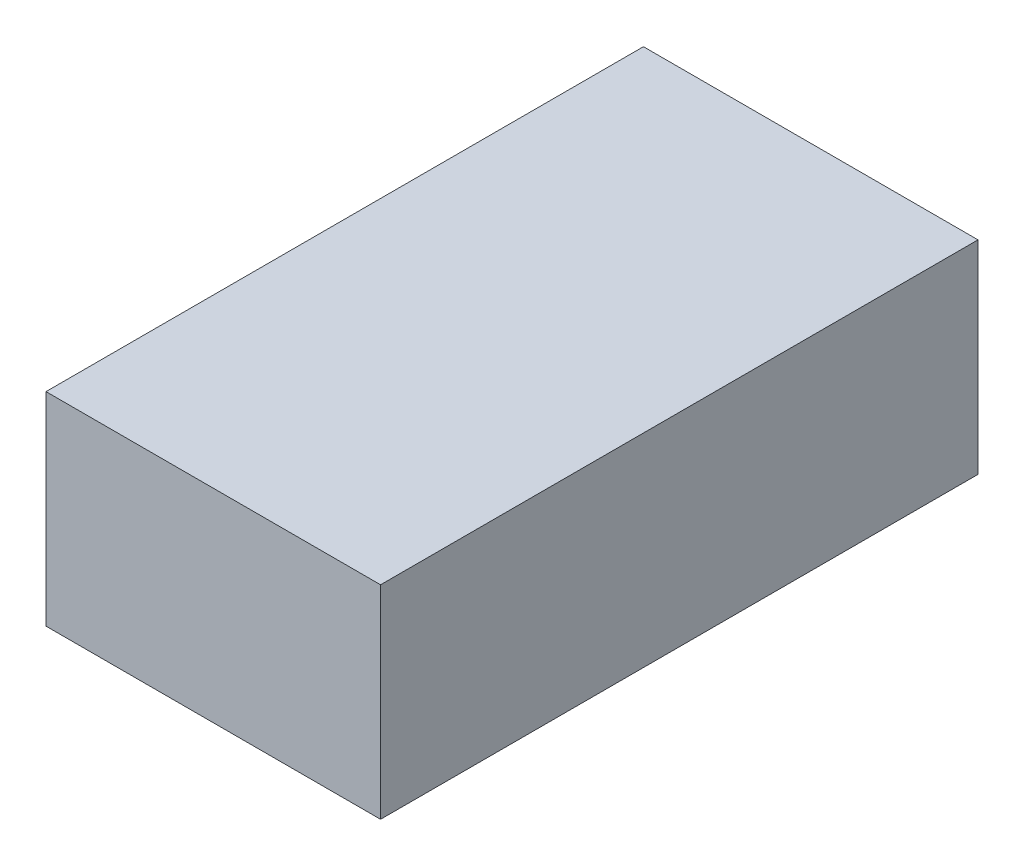
ISO-10303-21;
HEADER;
FILE_DESCRIPTION(('STEP AP214'),'2;1');
FILE_NAME('part.step','',(''),(''),'','','');
FILE_SCHEMA(('AUTOMOTIVE_DESIGN { 1 0 10303 214 1 1 1 1 }'));
ENDSEC;
DATA;
#1=APPLICATION_CONTEXT('core data for automotive mechanical design processes');
#2=APPLICATION_PROTOCOL_DEFINITION('international standard','automotive_design',2000,#1);
#3=PRODUCT_CONTEXT('',#1,'mechanical');
#4=PRODUCT('Part','Part','',(#3));
#5=PRODUCT_RELATED_PRODUCT_CATEGORY('part','',(#4));
#6=PRODUCT_DEFINITION_FORMATION('','',#4);
#7=PRODUCT_DEFINITION_CONTEXT('part definition',#1,'design');
#8=PRODUCT_DEFINITION('design','',#6,#7);
#9=PRODUCT_DEFINITION_SHAPE('','',#8);
#10=(LENGTH_UNIT() NAMED_UNIT(*) SI_UNIT(.MILLI.,.METRE.));
#11=(NAMED_UNIT(*) PLANE_ANGLE_UNIT() SI_UNIT($,.RADIAN.));
#12=(NAMED_UNIT(*) SI_UNIT($,.STERADIAN.) SOLID_ANGLE_UNIT());
#13=UNCERTAINTY_MEASURE_WITH_UNIT(LENGTH_MEASURE(1.E-05),#10,'distance_accuracy_value','');
#14=(GEOMETRIC_REPRESENTATION_CONTEXT(3) GLOBAL_UNCERTAINTY_ASSIGNED_CONTEXT((#13)) GLOBAL_UNIT_ASSIGNED_CONTEXT((#10,
#11,#12)) REPRESENTATION_CONTEXT('',''));
#15=CARTESIAN_POINT('',(0.,0.,0.));
#16=DIRECTION('',(0.,0.,1.));
#17=DIRECTION('',(1.,0.,0.));
#18=AXIS2_PLACEMENT_3D('',#15,#16,#17);
#19=CARTESIAN_POINT('',(0.,17.,0.));
#20=DIRECTION('',(1.,0.,0.));
#21=DIRECTION('',(0.,0.,-1.));
#22=AXIS2_PLACEMENT_3D('',#19,#20,#21);
#23=PLANE('',#22);
#24=DIRECTION('',(0.,0.,1.));
#25=VECTOR('',#24,1.);
#26=CARTESIAN_POINT('',(0.,0.,0.));
#27=LINE('',#26,#25);
#28=CARTESIAN_POINT('',(0.,0.,-50.));
#29=VERTEX_POINT('',#28);
#30=CARTESIAN_POINT('',(0.,0.,0.));
#31=VERTEX_POINT('',#30);
#32=EDGE_CURVE('E95',#29,#31,#27,.T.);
#33=ORIENTED_EDGE('',*,*,#32,.T.);
#34=DIRECTION('',(0.,-1.,0.));
#35=VECTOR('',#34,1.);
#36=CARTESIAN_POINT('',(0.,17.,0.));
#37=LINE('',#36,#35);
#38=CARTESIAN_POINT('',(0.,17.,0.));
#39=VERTEX_POINT('',#38);
#40=EDGE_CURVE('E11',#39,#31,#37,.T.);
#41=ORIENTED_EDGE('',*,*,#40,.F.);
#42=DIRECTION('',(0.,0.,1.));
#43=VECTOR('',#42,1.);
#44=CARTESIAN_POINT('',(0.,17.,0.));
#45=LINE('',#44,#43);
#46=CARTESIAN_POINT('',(0.,17.,-50.));
#47=VERTEX_POINT('',#46);
#48=EDGE_CURVE('E83',#47,#39,#45,.T.);
#49=ORIENTED_EDGE('',*,*,#48,.F.);
#50=DIRECTION('',(0.,-1.,0.));
#51=VECTOR('',#50,1.);
#52=CARTESIAN_POINT('',(0.,17.,-50.));
#53=LINE('',#52,#51);
#54=EDGE_CURVE('E91',#47,#29,#53,.T.);
#55=ORIENTED_EDGE('',*,*,#54,.T.);
#56=EDGE_LOOP('',(#33,#41,#49,#55));
#57=FACE_BOUND('',#56,.T.);
#58=ADVANCED_FACE('F32',(#57),#23,.F.);
#59=CARTESIAN_POINT('',(0.,17.,0.));
#60=DIRECTION('',(0.,0.,-1.));
#61=DIRECTION('',(-1.,0.,0.));
#62=AXIS2_PLACEMENT_3D('',#59,#60,#61);
#63=PLANE('',#62);
#64=DIRECTION('',(1.,0.,0.));
#65=VECTOR('',#64,1.);
#66=CARTESIAN_POINT('',(0.,0.,0.));
#67=LINE('',#66,#65);
#68=CARTESIAN_POINT('',(28.,0.,0.));
#69=VERTEX_POINT('',#68);
#70=EDGE_CURVE('E87',#31,#69,#67,.T.);
#71=ORIENTED_EDGE('',*,*,#70,.T.);
#72=DIRECTION('',(0.,-1.,0.));
#73=VECTOR('',#72,1.);
#74=CARTESIAN_POINT('',(28.,17.,0.));
#75=LINE('',#74,#73);
#76=CARTESIAN_POINT('',(28.,17.,0.));
#77=VERTEX_POINT('',#76);
#78=EDGE_CURVE('E40',#77,#69,#75,.T.);
#79=ORIENTED_EDGE('',*,*,#78,.F.);
#80=DIRECTION('',(1.,0.,0.));
#81=VECTOR('',#80,1.);
#82=CARTESIAN_POINT('',(0.,17.,0.));
#83=LINE('',#82,#81);
#84=EDGE_CURVE('E78',#39,#77,#83,.T.);
#85=ORIENTED_EDGE('',*,*,#84,.F.);
#86=ORIENTED_EDGE('',*,*,#40,.T.);
#87=EDGE_LOOP('',(#71,#79,#85,#86));
#88=FACE_BOUND('',#87,.T.);
#89=ADVANCED_FACE('F86',(#88),#63,.F.);
#90=CARTESIAN_POINT('',(28.,17.,0.));
#91=DIRECTION('',(-1.,0.,0.));
#92=DIRECTION('',(0.,0.,1.));
#93=AXIS2_PLACEMENT_3D('',#90,#91,#92);
#94=PLANE('',#93);
#95=DIRECTION('',(0.,0.,-1.));
#96=VECTOR('',#95,1.);
#97=CARTESIAN_POINT('',(28.,0.,0.));
#98=LINE('',#97,#96);
#99=CARTESIAN_POINT('',(28.,0.,-50.));
#100=VERTEX_POINT('',#99);
#101=EDGE_CURVE('E65',#69,#100,#98,.T.);
#102=ORIENTED_EDGE('',*,*,#101,.T.);
#103=DIRECTION('',(0.,-1.,0.));
#104=VECTOR('',#103,1.);
#105=CARTESIAN_POINT('',(28.,17.,-50.));
#106=LINE('',#105,#104);
#107=CARTESIAN_POINT('',(28.,17.,-50.));
#108=VERTEX_POINT('',#107);
#109=EDGE_CURVE('E88',#108,#100,#106,.T.);
#110=ORIENTED_EDGE('',*,*,#109,.F.);
#111=DIRECTION('',(0.,0.,-1.));
#112=VECTOR('',#111,1.);
#113=CARTESIAN_POINT('',(28.,17.,0.));
#114=LINE('',#113,#112);
#115=EDGE_CURVE('E81',#77,#108,#114,.T.);
#116=ORIENTED_EDGE('',*,*,#115,.F.);
#117=ORIENTED_EDGE('',*,*,#78,.T.);
#118=EDGE_LOOP('',(#102,#110,#116,#117));
#119=FACE_BOUND('',#118,.T.);
#120=ADVANCED_FACE('F89',(#119),#94,.F.);
#121=CARTESIAN_POINT('',(0.,17.,-50.));
#122=DIRECTION('',(0.,0.,1.));
#123=DIRECTION('',(1.,0.,0.));
#124=AXIS2_PLACEMENT_3D('',#121,#122,#123);
#125=PLANE('',#124);
#126=DIRECTION('',(-1.,0.,0.));
#127=VECTOR('',#126,1.);
#128=CARTESIAN_POINT('',(0.,0.,-50.));
#129=LINE('',#128,#127);
#130=EDGE_CURVE('E71',#100,#29,#129,.T.);
#131=ORIENTED_EDGE('',*,*,#130,.T.);
#132=ORIENTED_EDGE('',*,*,#54,.F.);
#133=DIRECTION('',(-1.,0.,0.));
#134=VECTOR('',#133,1.);
#135=CARTESIAN_POINT('',(0.,17.,-50.));
#136=LINE('',#135,#134);
#137=EDGE_CURVE('E48',#108,#47,#136,.T.);
#138=ORIENTED_EDGE('',*,*,#137,.F.);
#139=ORIENTED_EDGE('',*,*,#109,.T.);
#140=EDGE_LOOP('',(#131,#132,#138,#139));
#141=FACE_BOUND('',#140,.T.);
#142=ADVANCED_FACE('F102',(#141),#125,.F.);
#143=CARTESIAN_POINT('',(0.,17.,0.));
#144=DIRECTION('',(0.,-1.,0.));
#145=DIRECTION('',(0.,0.,-1.));
#146=AXIS2_PLACEMENT_3D('',#143,#144,#145);
#147=PLANE('',#146);
#148=ORIENTED_EDGE('',*,*,#48,.T.);
#149=ORIENTED_EDGE('',*,*,#84,.T.);
#150=ORIENTED_EDGE('',*,*,#115,.T.);
#151=ORIENTED_EDGE('',*,*,#137,.T.);
#152=EDGE_LOOP('',(#148,#149,#150,#151));
#153=FACE_BOUND('',#152,.T.);
#154=ADVANCED_FACE('F79',(#153),#147,.F.);
#155=CARTESIAN_POINT('',(0.,0.,0.));
#156=DIRECTION('',(0.,-1.,0.));
#157=DIRECTION('',(0.,0.,-1.));
#158=AXIS2_PLACEMENT_3D('',#155,#156,#157);
#159=PLANE('',#158);
#160=ORIENTED_EDGE('',*,*,#32,.F.);
#161=ORIENTED_EDGE('',*,*,#130,.F.);
#162=ORIENTED_EDGE('',*,*,#101,.F.);
#163=ORIENTED_EDGE('',*,*,#70,.F.);
#164=EDGE_LOOP('',(#160,#161,#162,#163));
#165=FACE_BOUND('',#164,.T.);
#166=ADVANCED_FACE('F105',(#165),#159,.T.);
#167=CLOSED_SHELL('',(#58,#89,#120,#142,#154,#166));
#168=MANIFOLD_SOLID_BREP('B2',#167);
#169=ADVANCED_BREP_SHAPE_REPRESENTATION('',(#18,#168),#14);
#170=SHAPE_DEFINITION_REPRESENTATION(#9,#169);
ENDSEC;
END-ISO-10303-21;
